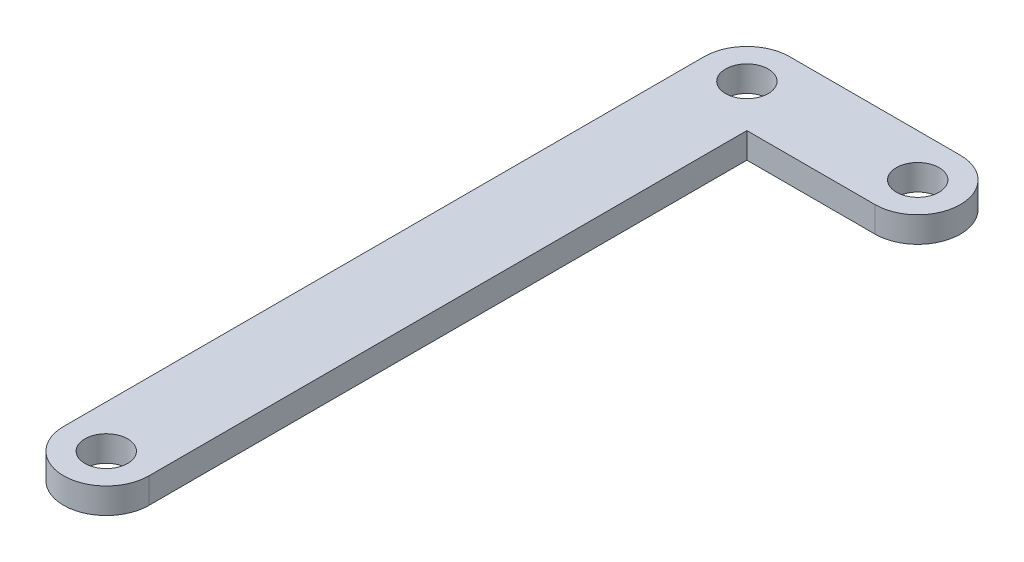
ISO-10303-21;
HEADER;
FILE_DESCRIPTION(('STEP AP214'),'2;1');
FILE_NAME('part.step','',(''),(''),'','','');
FILE_SCHEMA(('AUTOMOTIVE_DESIGN { 1 0 10303 214 1 1 1 1 }'));
ENDSEC;
DATA;
#1=APPLICATION_CONTEXT('core data for automotive mechanical design processes');
#2=APPLICATION_PROTOCOL_DEFINITION('international standard','automotive_design',2000,#1);
#3=PRODUCT_CONTEXT('',#1,'mechanical');
#4=PRODUCT('Part','Part','',(#3));
#5=PRODUCT_RELATED_PRODUCT_CATEGORY('part','',(#4));
#6=PRODUCT_DEFINITION_FORMATION('','',#4);
#7=PRODUCT_DEFINITION_CONTEXT('part definition',#1,'design');
#8=PRODUCT_DEFINITION('design','',#6,#7);
#9=PRODUCT_DEFINITION_SHAPE('','',#8);
#10=(LENGTH_UNIT() NAMED_UNIT(*) SI_UNIT(.MILLI.,.METRE.));
#11=(NAMED_UNIT(*) PLANE_ANGLE_UNIT() SI_UNIT($,.RADIAN.));
#12=(NAMED_UNIT(*) SI_UNIT($,.STERADIAN.) SOLID_ANGLE_UNIT());
#13=UNCERTAINTY_MEASURE_WITH_UNIT(LENGTH_MEASURE(1.E-05),#10,'distance_accuracy_value','');
#14=(GEOMETRIC_REPRESENTATION_CONTEXT(3) GLOBAL_UNCERTAINTY_ASSIGNED_CONTEXT((#13)) GLOBAL_UNIT_ASSIGNED_CONTEXT((#10,
#11,#12)) REPRESENTATION_CONTEXT('',''));
#15=CARTESIAN_POINT('',(0.,0.,0.));
#16=DIRECTION('',(0.,0.,1.));
#17=DIRECTION('',(1.,0.,0.));
#18=AXIS2_PLACEMENT_3D('',#15,#16,#17);
#19=CARTESIAN_POINT('',(29.0687695911701,3.,0.));
#20=DIRECTION('',(-1.,0.,0.));
#21=DIRECTION('',(0.,0.,1.));
#22=AXIS2_PLACEMENT_3D('',#19,#20,#21);
#23=PLANE('',#22);
#24=DIRECTION('',(0.,0.,-1.));
#25=VECTOR('',#24,1.);
#26=CARTESIAN_POINT('',(29.0687695911701,0.,0.));
#27=LINE('',#26,#25);
#28=CARTESIAN_POINT('',(29.0687695911702,0.,48.42576461806));
#29=VERTEX_POINT('',#28);
#30=CARTESIAN_POINT('',(29.0687695911701,0.,-21.57423538194));
#31=VERTEX_POINT('',#30);
#32=EDGE_CURVE('E143',#29,#31,#27,.T.);
#33=ORIENTED_EDGE('',*,*,#32,.T.);
#34=DIRECTION('',(0.,-1.,0.));
#35=VECTOR('',#34,1.);
#36=CARTESIAN_POINT('',(29.0687695911701,3.,-21.57423538194));
#37=LINE('',#36,#35);
#38=CARTESIAN_POINT('',(29.0687695911701,3.,-21.57423538194));
#39=VERTEX_POINT('',#38);
#40=EDGE_CURVE('E11',#39,#31,#37,.T.);
#41=ORIENTED_EDGE('',*,*,#40,.F.);
#42=DIRECTION('',(0.,0.,-1.));
#43=VECTOR('',#42,1.);
#44=CARTESIAN_POINT('',(29.0687695911701,3.,0.));
#45=LINE('',#44,#43);
#46=CARTESIAN_POINT('',(29.0687695911702,3.,48.42576461806));
#47=VERTEX_POINT('',#46);
#48=EDGE_CURVE('E185',#47,#39,#45,.T.);
#49=ORIENTED_EDGE('',*,*,#48,.F.);
#50=DIRECTION('',(0.,-1.,0.));
#51=VECTOR('',#50,1.);
#52=CARTESIAN_POINT('',(29.0687695911702,3.,48.42576461806));
#53=LINE('',#52,#51);
#54=EDGE_CURVE('E139',#47,#29,#53,.T.);
#55=ORIENTED_EDGE('',*,*,#54,.T.);
#56=EDGE_LOOP('',(#33,#41,#49,#55));
#57=FACE_BOUND('',#56,.T.);
#58=ADVANCED_FACE('F43',(#57),#23,.F.);
#59=CARTESIAN_POINT('',(0.,3.,-21.57423538194));
#60=DIRECTION('',(0.,0.,-1.));
#61=DIRECTION('',(-1.,0.,0.));
#62=AXIS2_PLACEMENT_3D('',#59,#60,#61);
#63=PLANE('',#62);
#64=DIRECTION('',(1.,0.,0.));
#65=VECTOR('',#64,1.);
#66=CARTESIAN_POINT('',(0.,0.,-21.57423538194));
#67=LINE('',#66,#65);
#68=CARTESIAN_POINT('',(44.0687695911702,0.,-21.57423538194));
#69=VERTEX_POINT('',#68);
#70=EDGE_CURVE('E146',#31,#69,#67,.T.);
#71=ORIENTED_EDGE('',*,*,#70,.T.);
#72=DIRECTION('',(0.,-1.,0.));
#73=VECTOR('',#72,1.);
#74=CARTESIAN_POINT('',(44.0687695911702,3.,-21.57423538194));
#75=LINE('',#74,#73);
#76=CARTESIAN_POINT('',(44.0687695911702,3.,-21.57423538194));
#77=VERTEX_POINT('',#76);
#78=EDGE_CURVE('E52',#77,#69,#75,.T.);
#79=ORIENTED_EDGE('',*,*,#78,.F.);
#80=DIRECTION('',(1.,0.,0.));
#81=VECTOR('',#80,1.);
#82=CARTESIAN_POINT('',(0.,3.,-21.57423538194));
#83=LINE('',#82,#81);
#84=EDGE_CURVE('E96',#39,#77,#83,.T.);
#85=ORIENTED_EDGE('',*,*,#84,.F.);
#86=ORIENTED_EDGE('',*,*,#40,.T.);
#87=EDGE_LOOP('',(#71,#79,#85,#86));
#88=FACE_BOUND('',#87,.T.);
#89=ADVANCED_FACE('F175',(#88),#63,.F.);
#90=CARTESIAN_POINT('',(44.0687695911702,3.,-26.57423538194));
#91=DIRECTION('',(0.,-1.,0.));
#92=DIRECTION('',(0.,0.,-1.));
#93=AXIS2_PLACEMENT_3D('',#90,#91,#92);
#94=CYLINDRICAL_SURFACE('',#93,5.);
#95=CARTESIAN_POINT('',(44.0687695911702,0.,-26.57423538194));
#96=DIRECTION('',(0.,1.,0.));
#97=DIRECTION('',(0.,0.,1.));
#98=AXIS2_PLACEMENT_3D('',#95,#96,#97);
#99=CIRCLE('',#98,5.);
#100=CARTESIAN_POINT('',(44.0687695911702,0.,-31.57423538194));
#101=VERTEX_POINT('',#100);
#102=EDGE_CURVE('E149',#101,#69,#99,.F.);
#103=ORIENTED_EDGE('',*,*,#102,.F.);
#104=DIRECTION('',(0.,-1.,0.));
#105=VECTOR('',#104,1.);
#106=CARTESIAN_POINT('',(44.0687695911702,3.,-31.57423538194));
#107=LINE('',#106,#105);
#108=CARTESIAN_POINT('',(44.0687695911702,3.,-31.57423538194));
#109=VERTEX_POINT('',#108);
#110=EDGE_CURVE('E169',#109,#101,#107,.T.);
#111=ORIENTED_EDGE('',*,*,#110,.F.);
#112=CARTESIAN_POINT('',(44.0687695911702,3.,-26.57423538194));
#113=DIRECTION('',(0.,1.,0.));
#114=DIRECTION('',(0.,0.,1.));
#115=AXIS2_PLACEMENT_3D('',#112,#113,#114);
#116=CIRCLE('',#115,5.);
#117=EDGE_CURVE('E174',#109,#77,#116,.F.);
#118=ORIENTED_EDGE('',*,*,#117,.T.);
#119=ORIENTED_EDGE('',*,*,#78,.T.);
#120=EDGE_LOOP('',(#103,#111,#118,#119));
#121=FACE_BOUND('',#120,.T.);
#122=ADVANCED_FACE('F173',(#121),#94,.T.);
#123=CARTESIAN_POINT('',(0.,3.,-31.57423538194));
#124=DIRECTION('',(0.,0.,-1.));
#125=DIRECTION('',(-1.,0.,0.));
#126=AXIS2_PLACEMENT_3D('',#123,#124,#125);
#127=PLANE('',#126);
#128=DIRECTION('',(1.,0.,0.));
#129=VECTOR('',#128,1.);
#130=CARTESIAN_POINT('',(0.,0.,-31.57423538194));
#131=LINE('',#130,#129);
#132=CARTESIAN_POINT('',(24.0687695911702,0.,-31.57423538194));
#133=VERTEX_POINT('',#132);
#134=EDGE_CURVE('E152',#133,#101,#131,.T.);
#135=ORIENTED_EDGE('',*,*,#134,.F.);
#136=DIRECTION('',(0.,-1.,0.));
#137=VECTOR('',#136,1.);
#138=CARTESIAN_POINT('',(24.0687695911702,3.,-31.57423538194));
#139=LINE('',#138,#137);
#140=CARTESIAN_POINT('',(24.0687695911702,3.,-31.57423538194));
#141=VERTEX_POINT('',#140);
#142=EDGE_CURVE('E126',#141,#133,#139,.T.);
#143=ORIENTED_EDGE('',*,*,#142,.F.);
#144=DIRECTION('',(1.,0.,0.));
#145=VECTOR('',#144,1.);
#146=CARTESIAN_POINT('',(0.,3.,-31.57423538194));
#147=LINE('',#146,#145);
#148=EDGE_CURVE('E115',#141,#109,#147,.T.);
#149=ORIENTED_EDGE('',*,*,#148,.T.);
#150=ORIENTED_EDGE('',*,*,#110,.T.);
#151=EDGE_LOOP('',(#135,#143,#149,#150));
#152=FACE_BOUND('',#151,.T.);
#153=ADVANCED_FACE('F183',(#152),#127,.T.);
#154=CARTESIAN_POINT('',(24.0687695911702,3.,-26.57423538194));
#155=DIRECTION('',(0.,-1.,0.));
#156=DIRECTION('',(0.,0.,-1.));
#157=AXIS2_PLACEMENT_3D('',#154,#155,#156);
#158=CYLINDRICAL_SURFACE('',#157,5.00000000000002);
#159=CARTESIAN_POINT('',(24.0687695911702,0.,-26.57423538194));
#160=DIRECTION('',(0.,1.,0.));
#161=DIRECTION('',(0.,0.,1.));
#162=AXIS2_PLACEMENT_3D('',#159,#160,#161);
#163=CIRCLE('',#162,5.00000000000002);
#164=CARTESIAN_POINT('',(19.0687695911701,0.,-26.57423538194));
#165=VERTEX_POINT('',#164);
#166=EDGE_CURVE('E122',#133,#165,#163,.T.);
#167=ORIENTED_EDGE('',*,*,#166,.T.);
#168=DIRECTION('',(0.,-1.,0.));
#169=VECTOR('',#168,1.);
#170=CARTESIAN_POINT('',(19.0687695911701,3.,-26.57423538194));
#171=LINE('',#170,#169);
#172=CARTESIAN_POINT('',(19.0687695911701,3.,-26.57423538194));
#173=VERTEX_POINT('',#172);
#174=EDGE_CURVE('E119',#173,#165,#171,.T.);
#175=ORIENTED_EDGE('',*,*,#174,.F.);
#176=CARTESIAN_POINT('',(24.0687695911702,3.,-26.57423538194));
#177=DIRECTION('',(0.,1.,0.));
#178=DIRECTION('',(0.,0.,1.));
#179=AXIS2_PLACEMENT_3D('',#176,#177,#178);
#180=CIRCLE('',#179,5.00000000000002);
#181=EDGE_CURVE('E107',#141,#173,#180,.T.);
#182=ORIENTED_EDGE('',*,*,#181,.F.);
#183=ORIENTED_EDGE('',*,*,#142,.T.);
#184=EDGE_LOOP('',(#167,#175,#182,#183));
#185=FACE_BOUND('',#184,.T.);
#186=ADVANCED_FACE('F120',(#185),#158,.T.);
#187=CARTESIAN_POINT('',(19.0687695911701,3.,0.));
#188=DIRECTION('',(-1.,0.,0.));
#189=DIRECTION('',(0.,0.,1.));
#190=AXIS2_PLACEMENT_3D('',#187,#188,#189);
#191=PLANE('',#190);
#192=DIRECTION('',(0.,0.,-1.));
#193=VECTOR('',#192,1.);
#194=CARTESIAN_POINT('',(19.0687695911701,0.,0.));
#195=LINE('',#194,#193);
#196=CARTESIAN_POINT('',(19.0687695911702,0.,48.42576461806));
#197=VERTEX_POINT('',#196);
#198=EDGE_CURVE('E156',#197,#165,#195,.T.);
#199=ORIENTED_EDGE('',*,*,#198,.F.);
#200=DIRECTION('',(0.,-1.,0.));
#201=VECTOR('',#200,1.);
#202=CARTESIAN_POINT('',(19.0687695911702,3.,48.42576461806));
#203=LINE('',#202,#201);
#204=CARTESIAN_POINT('',(19.0687695911702,3.,48.42576461806));
#205=VERTEX_POINT('',#204);
#206=EDGE_CURVE('E85',#205,#197,#203,.T.);
#207=ORIENTED_EDGE('',*,*,#206,.F.);
#208=DIRECTION('',(0.,0.,-1.));
#209=VECTOR('',#208,1.);
#210=CARTESIAN_POINT('',(19.0687695911701,3.,0.));
#211=LINE('',#210,#209);
#212=EDGE_CURVE('E112',#205,#173,#211,.T.);
#213=ORIENTED_EDGE('',*,*,#212,.T.);
#214=ORIENTED_EDGE('',*,*,#174,.T.);
#215=EDGE_LOOP('',(#199,#207,#213,#214));
#216=FACE_BOUND('',#215,.T.);
#217=ADVANCED_FACE('F128',(#216),#191,.T.);
#218=CARTESIAN_POINT('',(24.0687695911702,3.,48.42576461806));
#219=DIRECTION('',(0.,-1.,0.));
#220=DIRECTION('',(0.,0.,-1.));
#221=AXIS2_PLACEMENT_3D('',#218,#219,#220);
#222=CYLINDRICAL_SURFACE('',#221,2.5);
#223=CARTESIAN_POINT('',(24.0687695911702,3.,48.42576461806));
#224=DIRECTION('',(0.,1.,0.));
#225=DIRECTION('',(0.,0.,1.));
#226=AXIS2_PLACEMENT_3D('',#223,#224,#225);
#227=CIRCLE('',#226,2.5);
#228=CARTESIAN_POINT('',(24.0687695911702,3.,50.92576461806));
#229=VERTEX_POINT('',#228);
#230=EDGE_CURVE('E130',#229,#229,#227,.T.);
#231=ORIENTED_EDGE('',*,*,#230,.T.);
#232=EDGE_LOOP('',(#231));
#233=FACE_BOUND('',#232,.T.);
#234=CARTESIAN_POINT('',(24.0687695911702,0.,48.42576461806));
#235=DIRECTION('',(0.,1.,0.));
#236=DIRECTION('',(0.,0.,1.));
#237=AXIS2_PLACEMENT_3D('',#234,#235,#236);
#238=CIRCLE('',#237,2.5);
#239=CARTESIAN_POINT('',(24.0687695911702,0.,50.92576461806));
#240=VERTEX_POINT('',#239);
#241=EDGE_CURVE('E159',#240,#240,#238,.T.);
#242=ORIENTED_EDGE('',*,*,#241,.F.);
#243=EDGE_LOOP('',(#242));
#244=FACE_BOUND('',#243,.T.);
#245=ADVANCED_FACE('F220',(#233,#244),#222,.F.);
#246=CARTESIAN_POINT('',(24.0687695911702,3.,48.42576461806));
#247=DIRECTION('',(0.,-1.,0.));
#248=DIRECTION('',(0.,0.,-1.));
#249=AXIS2_PLACEMENT_3D('',#246,#247,#248);
#250=CYLINDRICAL_SURFACE('',#249,5.);
#251=CARTESIAN_POINT('',(24.0687695911702,0.,48.42576461806));
#252=DIRECTION('',(0.,1.,0.));
#253=DIRECTION('',(0.,0.,1.));
#254=AXIS2_PLACEMENT_3D('',#251,#252,#253);
#255=CIRCLE('',#254,5.);
#256=EDGE_CURVE('E88',#197,#29,#255,.T.);
#257=ORIENTED_EDGE('',*,*,#256,.T.);
#258=ORIENTED_EDGE('',*,*,#54,.F.);
#259=CARTESIAN_POINT('',(24.0687695911702,3.,48.42576461806));
#260=DIRECTION('',(0.,1.,0.));
#261=DIRECTION('',(0.,0.,1.));
#262=AXIS2_PLACEMENT_3D('',#259,#260,#261);
#263=CIRCLE('',#262,5.);
#264=EDGE_CURVE('E60',#205,#47,#263,.T.);
#265=ORIENTED_EDGE('',*,*,#264,.F.);
#266=ORIENTED_EDGE('',*,*,#206,.T.);
#267=EDGE_LOOP('',(#257,#258,#265,#266));
#268=FACE_BOUND('',#267,.T.);
#269=ADVANCED_FACE('F221',(#268),#250,.T.);
#270=CARTESIAN_POINT('',(24.0687695911702,3.,-26.57423538194));
#271=DIRECTION('',(0.,-1.,0.));
#272=DIRECTION('',(0.,0.,-1.));
#273=AXIS2_PLACEMENT_3D('',#270,#271,#272);
#274=CYLINDRICAL_SURFACE('',#273,2.5);
#275=CARTESIAN_POINT('',(24.0687695911702,3.,-26.57423538194));
#276=DIRECTION('',(0.,1.,0.));
#277=DIRECTION('',(0.,0.,1.));
#278=AXIS2_PLACEMENT_3D('',#275,#276,#277);
#279=CIRCLE('',#278,2.5);
#280=CARTESIAN_POINT('',(24.0687695911702,3.,-24.07423538194));
#281=VERTEX_POINT('',#280);
#282=EDGE_CURVE('E165',#281,#281,#279,.T.);
#283=ORIENTED_EDGE('',*,*,#282,.T.);
#284=EDGE_LOOP('',(#283));
#285=FACE_BOUND('',#284,.T.);
#286=CARTESIAN_POINT('',(24.0687695911702,0.,-26.57423538194));
#287=DIRECTION('',(0.,1.,0.));
#288=DIRECTION('',(0.,0.,1.));
#289=AXIS2_PLACEMENT_3D('',#286,#287,#288);
#290=CIRCLE('',#289,2.5);
#291=CARTESIAN_POINT('',(24.0687695911702,0.,-24.07423538194));
#292=VERTEX_POINT('',#291);
#293=EDGE_CURVE('E140',#292,#292,#290,.T.);
#294=ORIENTED_EDGE('',*,*,#293,.F.);
#295=EDGE_LOOP('',(#294));
#296=FACE_BOUND('',#295,.T.);
#297=ADVANCED_FACE('F45',(#285,#296),#274,.F.);
#298=CARTESIAN_POINT('',(44.0687695911702,3.,-26.57423538194));
#299=DIRECTION('',(0.,-1.,0.));
#300=DIRECTION('',(0.,0.,-1.));
#301=AXIS2_PLACEMENT_3D('',#298,#299,#300);
#302=CYLINDRICAL_SURFACE('',#301,2.5);
#303=CARTESIAN_POINT('',(44.0687695911702,3.,-26.57423538194));
#304=DIRECTION('',(0.,1.,0.));
#305=DIRECTION('',(0.,0.,1.));
#306=AXIS2_PLACEMENT_3D('',#303,#304,#305);
#307=CIRCLE('',#306,2.5);
#308=CARTESIAN_POINT('',(44.0687695911702,3.,-24.07423538194));
#309=VERTEX_POINT('',#308);
#310=EDGE_CURVE('E136',#309,#309,#307,.T.);
#311=ORIENTED_EDGE('',*,*,#310,.T.);
#312=EDGE_LOOP('',(#311));
#313=FACE_BOUND('',#312,.T.);
#314=CARTESIAN_POINT('',(44.0687695911702,0.,-26.57423538194));
#315=DIRECTION('',(0.,1.,0.));
#316=DIRECTION('',(0.,0.,1.));
#317=AXIS2_PLACEMENT_3D('',#314,#315,#316);
#318=CIRCLE('',#317,2.5);
#319=CARTESIAN_POINT('',(44.0687695911702,0.,-24.07423538194));
#320=VERTEX_POINT('',#319);
#321=EDGE_CURVE('E162',#320,#320,#318,.T.);
#322=ORIENTED_EDGE('',*,*,#321,.F.);
#323=EDGE_LOOP('',(#322));
#324=FACE_BOUND('',#323,.T.);
#325=ADVANCED_FACE('F195',(#313,#324),#302,.F.);
#326=CARTESIAN_POINT('',(0.,3.,0.));
#327=DIRECTION('',(0.,1.,0.));
#328=DIRECTION('',(0.,0.,1.));
#329=AXIS2_PLACEMENT_3D('',#326,#327,#328);
#330=PLANE('',#329);
#331=ORIENTED_EDGE('',*,*,#282,.F.);
#332=EDGE_LOOP('',(#331));
#333=FACE_BOUND('',#332,.T.);
#334=ORIENTED_EDGE('',*,*,#48,.T.);
#335=ORIENTED_EDGE('',*,*,#84,.T.);
#336=ORIENTED_EDGE('',*,*,#117,.F.);
#337=ORIENTED_EDGE('',*,*,#148,.F.);
#338=ORIENTED_EDGE('',*,*,#181,.T.);
#339=ORIENTED_EDGE('',*,*,#212,.F.);
#340=ORIENTED_EDGE('',*,*,#264,.T.);
#341=EDGE_LOOP('',(#334,#335,#336,#337,#338,#339,#340));
#342=FACE_BOUND('',#341,.T.);
#343=ORIENTED_EDGE('',*,*,#230,.F.);
#344=EDGE_LOOP('',(#343));
#345=FACE_BOUND('',#344,.T.);
#346=ORIENTED_EDGE('',*,*,#310,.F.);
#347=EDGE_LOOP('',(#346));
#348=FACE_BOUND('',#347,.T.);
#349=ADVANCED_FACE('F109',(#333,#342,#345,#348),#330,.T.);
#350=CARTESIAN_POINT('',(0.,0.,0.));
#351=DIRECTION('',(0.,1.,0.));
#352=DIRECTION('',(0.,0.,1.));
#353=AXIS2_PLACEMENT_3D('',#350,#351,#352);
#354=PLANE('',#353);
#355=ORIENTED_EDGE('',*,*,#293,.T.);
#356=EDGE_LOOP('',(#355));
#357=FACE_BOUND('',#356,.T.);
#358=ORIENTED_EDGE('',*,*,#32,.F.);
#359=ORIENTED_EDGE('',*,*,#256,.F.);
#360=ORIENTED_EDGE('',*,*,#198,.T.);
#361=ORIENTED_EDGE('',*,*,#166,.F.);
#362=ORIENTED_EDGE('',*,*,#134,.T.);
#363=ORIENTED_EDGE('',*,*,#102,.T.);
#364=ORIENTED_EDGE('',*,*,#70,.F.);
#365=EDGE_LOOP('',(#358,#359,#360,#361,#362,#363,#364));
#366=FACE_BOUND('',#365,.T.);
#367=ORIENTED_EDGE('',*,*,#241,.T.);
#368=EDGE_LOOP('',(#367));
#369=FACE_BOUND('',#368,.T.);
#370=ORIENTED_EDGE('',*,*,#321,.T.);
#371=EDGE_LOOP('',(#370));
#372=FACE_BOUND('',#371,.T.);
#373=ADVANCED_FACE('F179',(#357,#366,#369,#372),#354,.F.);
#374=CLOSED_SHELL('',(#58,#89,#122,#153,#186,#217,#245,#269,#297,#325,#349,#373));
#375=MANIFOLD_SOLID_BREP('B2',#374);
#376=ADVANCED_BREP_SHAPE_REPRESENTATION('',(#18,#375),#14);
#377=SHAPE_DEFINITION_REPRESENTATION(#9,#376);
ENDSEC;
END-ISO-10303-21;
